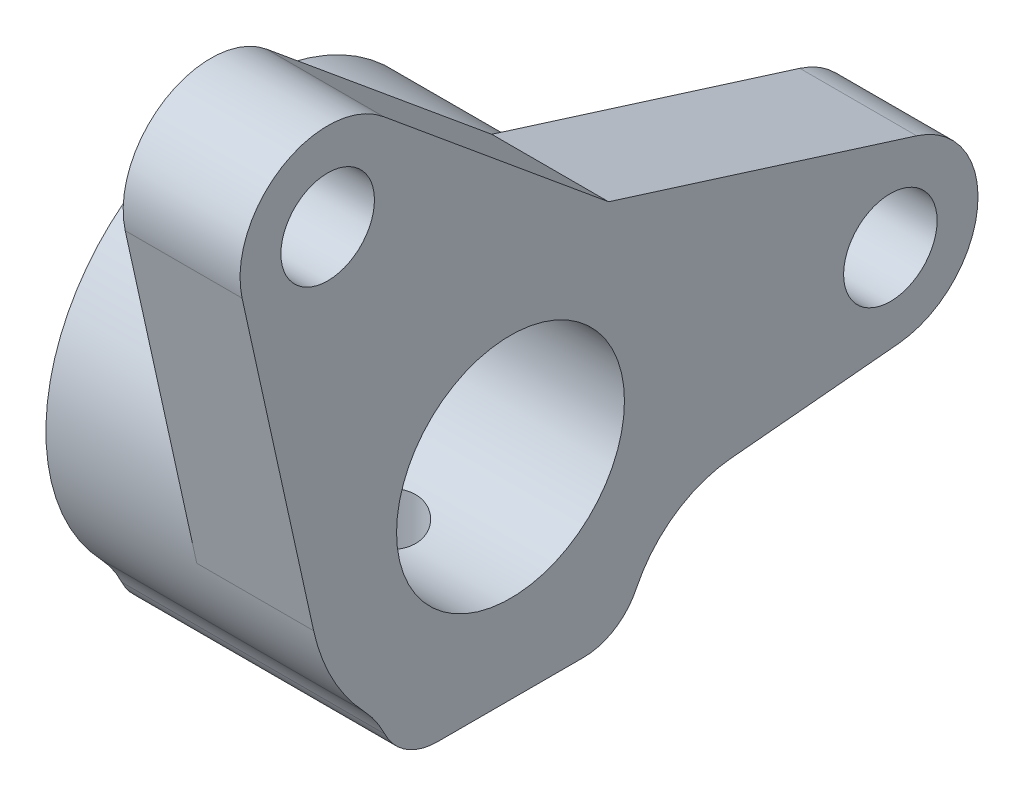
ISO-10303-21;
HEADER;
FILE_DESCRIPTION(('STEP AP214'),'2;1');
FILE_NAME('part.step','',(''),(''),'','','');
FILE_SCHEMA(('AUTOMOTIVE_DESIGN { 1 0 10303 214 1 1 1 1 }'));
ENDSEC;
DATA;
#1=APPLICATION_CONTEXT('core data for automotive mechanical design processes');
#2=APPLICATION_PROTOCOL_DEFINITION('international standard','automotive_design',2000,#1);
#3=PRODUCT_CONTEXT('',#1,'mechanical');
#4=PRODUCT('Part','Part','',(#3));
#5=PRODUCT_RELATED_PRODUCT_CATEGORY('part','',(#4));
#6=PRODUCT_DEFINITION_FORMATION('','',#4);
#7=PRODUCT_DEFINITION_CONTEXT('part definition',#1,'design');
#8=PRODUCT_DEFINITION('design','',#6,#7);
#9=PRODUCT_DEFINITION_SHAPE('','',#8);
#10=(LENGTH_UNIT() NAMED_UNIT(*) SI_UNIT(.MILLI.,.METRE.));
#11=(NAMED_UNIT(*) PLANE_ANGLE_UNIT() SI_UNIT($,.RADIAN.));
#12=(NAMED_UNIT(*) SI_UNIT($,.STERADIAN.) SOLID_ANGLE_UNIT());
#13=UNCERTAINTY_MEASURE_WITH_UNIT(LENGTH_MEASURE(1.E-05),#10,'distance_accuracy_value','');
#14=(GEOMETRIC_REPRESENTATION_CONTEXT(3) GLOBAL_UNCERTAINTY_ASSIGNED_CONTEXT((#13)) GLOBAL_UNIT_ASSIGNED_CONTEXT((#10,
#11,#12)) REPRESENTATION_CONTEXT('',''));
#15=CARTESIAN_POINT('',(0.,0.,0.));
#16=DIRECTION('',(0.,0.,1.));
#17=DIRECTION('',(1.,0.,0.));
#18=AXIS2_PLACEMENT_3D('',#15,#16,#17);
#19=CARTESIAN_POINT('',(-10.5,0.,0.));
#20=DIRECTION('',(1.,0.,0.));
#21=DIRECTION('',(0.,0.,-1.));
#22=AXIS2_PLACEMENT_3D('',#19,#20,#21);
#23=PLANE('',#22);
#24=CARTESIAN_POINT('',(-10.5,10.2399340465581,6.25649668122183));
#25=DIRECTION('',(-1.,0.,0.));
#26=DIRECTION('',(0.,0.,1.));
#27=AXIS2_PLACEMENT_3D('',#24,#25,#26);
#28=CIRCLE('',#27,1.59999999999999);
#29=CARTESIAN_POINT('',(-10.5,10.2399340465581,7.85649668122181));
#30=VERTEX_POINT('',#29);
#31=EDGE_CURVE('E587',#30,#30,#28,.T.);
#32=ORIENTED_EDGE('',*,*,#31,.F.);
#33=EDGE_LOOP('',(#32));
#34=FACE_BOUND('',#33,.T.);
#35=CARTESIAN_POINT('',(-10.5,-7.50446189380285,-7.90525468814642));
#36=DIRECTION('',(1.,0.,0.));
#37=DIRECTION('',(0.,0.,-1.));
#38=AXIS2_PLACEMENT_3D('',#35,#36,#37);
#39=CIRCLE('',#38,4.00000000000001);
#40=CARTESIAN_POINT('',(-10.5,-3.52167690603392,-7.53454760539433));
#41=VERTEX_POINT('',#40);
#42=CARTESIAN_POINT('',(-10.5,-4.75053092359996,-5.00424379341379));
#43=VERTEX_POINT('',#42);
#44=EDGE_CURVE('E157',#41,#43,#39,.T.);
#45=ORIENTED_EDGE('',*,*,#44,.T.);
#46=CARTESIAN_POINT('',(-10.5,0.,0.));
#47=DIRECTION('',(1.,0.,0.));
#48=DIRECTION('',(0.,0.,-1.));
#49=AXIS2_PLACEMENT_3D('',#46,#47,#48);
#50=CIRCLE('',#49,6.9);
#51=CARTESIAN_POINT('',(-10.5,-1.48860487136868,6.73751107879887));
#52=VERTEX_POINT('',#51);
#53=EDGE_CURVE('E223',#43,#52,#50,.T.);
#54=ORIENTED_EDGE('',*,*,#53,.T.);
#55=DIRECTION('',(0.,-0.976450880985343,-0.215739836430243));
#56=VECTOR('',#55,1.);
#57=CARTESIAN_POINT('',(-10.5,-1.48860487136868,6.73751107879887));
#58=LINE('',#57,#56);
#59=CARTESIAN_POINT('',(-10.5,9.5927145372674,9.18584932417786));
#60=VERTEX_POINT('',#59);
#61=EDGE_CURVE('E154',#60,#52,#58,.T.);
#62=ORIENTED_EDGE('',*,*,#61,.F.);
#63=CARTESIAN_POINT('',(-10.5,10.2399340465581,6.25649668122183));
#64=DIRECTION('',(1.,0.,0.));
#65=DIRECTION('',(0.,0.,-1.));
#66=AXIS2_PLACEMENT_3D('',#63,#64,#65);
#67=CIRCLE('',#66,3.);
#68=CARTESIAN_POINT('',(-10.5,12.5511428384146,4.34382474896435));
#69=VERTEX_POINT('',#68);
#70=EDGE_CURVE('E88',#69,#60,#67,.T.);
#71=ORIENTED_EDGE('',*,*,#70,.F.);
#72=DIRECTION('',(0.,-0.637557310752494,-0.770402930618808));
#73=VECTOR('',#72,1.);
#74=CARTESIAN_POINT('',(-10.5,5.31578022126978,-4.39914544419221));
#75=LINE('',#74,#73);
#76=CARTESIAN_POINT('',(-10.5,6.17695717575124,-3.35852801525733));
#77=VERTEX_POINT('',#76);
#78=EDGE_CURVE('E168',#69,#77,#75,.T.);
#79=ORIENTED_EDGE('',*,*,#78,.T.);
#80=DIRECTION('',(0.,-0.299999999999995,-0.953939201416947));
#81=VECTOR('',#80,1.);
#82=CARTESIAN_POINT('',(-10.5,6.58218048977694,-2.06999999999997));
#83=LINE('',#82,#81);
#84=CARTESIAN_POINT('',(-10.5,2.86181760425091,-13.9));
#85=VERTEX_POINT('',#84);
#86=EDGE_CURVE('E130',#77,#85,#83,.T.);
#87=ORIENTED_EDGE('',*,*,#86,.T.);
#88=CARTESIAN_POINT('',(-10.5,0.,-13.));
#89=DIRECTION('',(1.,0.,0.));
#90=DIRECTION('',(0.,0.,-1.));
#91=AXIS2_PLACEMENT_3D('',#88,#89,#90);
#92=CIRCLE('',#91,2.99999999999999);
#93=CARTESIAN_POINT('',(-10.5,-2.98708874082661,-13.2780303120641));
#94=VERTEX_POINT('',#93);
#95=EDGE_CURVE('E164',#85,#94,#92,.F.);
#96=ORIENTED_EDGE('',*,*,#95,.T.);
#97=DIRECTION('',(0.,-0.0926767706880218,0.995696246942229));
#98=VECTOR('',#97,1.);
#99=CARTESIAN_POINT('',(-10.5,-4.18670160661286,-0.38968710179114));
#100=LINE('',#99,#98);
#101=EDGE_CURVE('E161',#94,#41,#100,.T.);
#102=ORIENTED_EDGE('',*,*,#101,.T.);
#103=EDGE_LOOP('',(#45,#54,#62,#71,#79,#87,#96,#102));
#104=FACE_BOUND('',#103,.T.);
#105=CARTESIAN_POINT('',(-10.5,0.,-13.));
#106=DIRECTION('',(-1.,0.,0.));
#107=DIRECTION('',(0.,0.,1.));
#108=AXIS2_PLACEMENT_3D('',#105,#106,#107);
#109=CIRCLE('',#108,1.59999999999999);
#110=CARTESIAN_POINT('',(-10.5,0.,-11.4));
#111=VERTEX_POINT('',#110);
#112=EDGE_CURVE('E580',#111,#111,#109,.T.);
#113=ORIENTED_EDGE('',*,*,#112,.F.);
#114=EDGE_LOOP('',(#113));
#115=FACE_BOUND('',#114,.T.);
#116=ADVANCED_FACE('F45',(#34,#104,#115),#23,.F.);
#117=CARTESIAN_POINT('',(-6.50000000000003,-1.48860487136868,6.73751107879887));
#118=DIRECTION('',(0.,0.215739836430243,-0.976450880985343));
#119=DIRECTION('',(0.,0.976450880985343,0.215739836430243));
#120=AXIS2_PLACEMENT_3D('',#117,#118,#119);
#121=PLANE('',#120);
#122=ORIENTED_EDGE('',*,*,#61,.T.);
#123=DIRECTION('',(-1.,0.,0.));
#124=VECTOR('',#123,1.);
#125=CARTESIAN_POINT('',(-6.50000000000003,-1.48860487136868,6.73751107879887));
#126=LINE('',#125,#124);
#127=CARTESIAN_POINT('',(-6.50000000000003,-1.48860487136868,6.73751107879887));
#128=VERTEX_POINT('',#127);
#129=EDGE_CURVE('E11',#128,#52,#126,.T.);
#130=ORIENTED_EDGE('',*,*,#129,.F.);
#131=DIRECTION('',(0.,-0.976450880985343,-0.215739836430243));
#132=VECTOR('',#131,1.);
#133=CARTESIAN_POINT('',(-6.50000000000003,-1.48860487136868,6.73751107879887));
#134=LINE('',#133,#132);
#135=CARTESIAN_POINT('',(-6.50000000000003,9.5927145372674,9.18584932417786));
#136=VERTEX_POINT('',#135);
#137=EDGE_CURVE('E171',#136,#128,#134,.T.);
#138=ORIENTED_EDGE('',*,*,#137,.F.);
#139=DIRECTION('',(-1.,0.,0.));
#140=VECTOR('',#139,1.);
#141=CARTESIAN_POINT('',(-6.50000000000003,9.5927145372674,9.18584932417786));
#142=LINE('',#141,#140);
#143=EDGE_CURVE('E153',#136,#60,#142,.T.);
#144=ORIENTED_EDGE('',*,*,#143,.T.);
#145=EDGE_LOOP('',(#122,#130,#138,#144));
#146=FACE_BOUND('',#145,.T.);
#147=ADVANCED_FACE('F47',(#146),#121,.F.);
#148=CARTESIAN_POINT('',(-6.50000000000003,0.,0.));
#149=DIRECTION('',(-1.,0.,0.));
#150=DIRECTION('',(0.,0.,1.));
#151=AXIS2_PLACEMENT_3D('',#148,#149,#150);
#152=CYLINDRICAL_SURFACE('',#151,6.9);
#153=ORIENTED_EDGE('',*,*,#129,.T.);
#154=ORIENTED_EDGE('',*,*,#53,.F.);
#155=DIRECTION('',(1.,0.,0.));
#156=VECTOR('',#155,1.);
#157=CARTESIAN_POINT('',(-15.5,-4.75053092359996,-5.00424379341379));
#158=LINE('',#157,#156);
#159=CARTESIAN_POINT('',(-15.5,-4.75053092359996,-5.00424379341379));
#160=VERTEX_POINT('',#159);
#161=EDGE_CURVE('E158',#160,#43,#158,.T.);
#162=ORIENTED_EDGE('',*,*,#161,.F.);
#163=CARTESIAN_POINT('',(-15.5,0.,0.));
#164=DIRECTION('',(1.,0.,0.));
#165=DIRECTION('',(0.,0.,-1.));
#166=AXIS2_PLACEMENT_3D('',#163,#164,#165);
#167=CIRCLE('',#166,6.9);
#168=CARTESIAN_POINT('',(-15.5,-4.75053092359996,5.00424379341379));
#169=VERTEX_POINT('',#168);
#170=EDGE_CURVE('E210',#160,#169,#167,.T.);
#171=ORIENTED_EDGE('',*,*,#170,.T.);
#172=DIRECTION('',(-1.,0.,0.));
#173=VECTOR('',#172,1.);
#174=CARTESIAN_POINT('',(-6.50000000000003,-4.75053092359996,5.00424379341379));
#175=LINE('',#174,#173);
#176=CARTESIAN_POINT('',(-6.50000000000003,-4.75053092359996,5.00424379341379));
#177=VERTEX_POINT('',#176);
#178=EDGE_CURVE('E54',#177,#169,#175,.T.);
#179=ORIENTED_EDGE('',*,*,#178,.F.);
#180=CARTESIAN_POINT('',(-6.50000000000003,0.,0.));
#181=DIRECTION('',(1.,0.,0.));
#182=DIRECTION('',(0.,0.,-1.));
#183=AXIS2_PLACEMENT_3D('',#180,#181,#182);
#184=CIRCLE('',#183,6.9);
#185=EDGE_CURVE('E96',#128,#177,#184,.T.);
#186=ORIENTED_EDGE('',*,*,#185,.F.);
#187=EDGE_LOOP('',(#153,#154,#162,#171,#179,#186));
#188=FACE_BOUND('',#187,.T.);
#189=ADVANCED_FACE('F216',(#188),#152,.T.);
#190=CARTESIAN_POINT('',(-6.50000000000003,-7.50446189380284,7.90525468814642));
#191=DIRECTION('',(-1.,0.,0.));
#192=DIRECTION('',(0.,0.,1.));
#193=AXIS2_PLACEMENT_3D('',#190,#191,#192);
#194=CYLINDRICAL_SURFACE('',#193,4.);
#195=ORIENTED_EDGE('',*,*,#178,.T.);
#196=CARTESIAN_POINT('',(-15.5,-7.50446189380284,7.90525468814642));
#197=DIRECTION('',(1.,0.,0.));
#198=DIRECTION('',(0.,0.,-1.));
#199=AXIS2_PLACEMENT_3D('',#196,#197,#198);
#200=CIRCLE('',#199,4.);
#201=CARTESIAN_POINT('',(-15.5,-5.76815396460094,4.30175156271547));
#202=VERTEX_POINT('',#201);
#203=EDGE_CURVE('E198',#202,#169,#200,.T.);
#204=ORIENTED_EDGE('',*,*,#203,.F.);
#205=DIRECTION('',(-1.,0.,0.));
#206=VECTOR('',#205,1.);
#207=CARTESIAN_POINT('',(-6.50000000000003,-5.76815396460094,4.30175156271547));
#208=LINE('',#207,#206);
#209=CARTESIAN_POINT('',(-6.50000000000003,-5.76815396460094,4.30175156271547));
#210=VERTEX_POINT('',#209);
#211=EDGE_CURVE('E188',#210,#202,#208,.T.);
#212=ORIENTED_EDGE('',*,*,#211,.F.);
#213=CARTESIAN_POINT('',(-6.50000000000003,-7.50446189380284,7.90525468814642));
#214=DIRECTION('',(1.,0.,0.));
#215=DIRECTION('',(0.,0.,-1.));
#216=AXIS2_PLACEMENT_3D('',#213,#214,#215);
#217=CIRCLE('',#216,4.);
#218=EDGE_CURVE('E201',#210,#177,#217,.T.);
#219=ORIENTED_EDGE('',*,*,#218,.T.);
#220=EDGE_LOOP('',(#195,#204,#212,#219));
#221=FACE_BOUND('',#220,.T.);
#222=ADVANCED_FACE('F196',(#221),#194,.F.);
#223=CARTESIAN_POINT('',(-6.50000000000003,-4.9,2.5));
#224=DIRECTION('',(-1.,0.,0.));
#225=DIRECTION('',(0.,0.,1.));
#226=AXIS2_PLACEMENT_3D('',#223,#224,#225);
#227=CYLINDRICAL_SURFACE('',#226,1.99999999999999);
#228=ORIENTED_EDGE('',*,*,#211,.T.);
#229=CARTESIAN_POINT('',(-15.5,-4.9,2.5));
#230=DIRECTION('',(1.,0.,0.));
#231=DIRECTION('',(0.,0.,-1.));
#232=AXIS2_PLACEMENT_3D('',#229,#230,#231);
#233=CIRCLE('',#232,1.99999999999999);
#234=CARTESIAN_POINT('',(-15.5,-6.89999999999999,2.5));
#235=VERTEX_POINT('',#234);
#236=EDGE_CURVE('E213',#235,#202,#233,.F.);
#237=ORIENTED_EDGE('',*,*,#236,.F.);
#238=DIRECTION('',(-1.,0.,0.));
#239=VECTOR('',#238,1.);
#240=CARTESIAN_POINT('',(-6.50000000000003,-6.89999999999999,2.5));
#241=LINE('',#240,#239);
#242=CARTESIAN_POINT('',(-6.50000000000003,-6.89999999999999,2.5));
#243=VERTEX_POINT('',#242);
#244=EDGE_CURVE('E185',#243,#235,#241,.T.);
#245=ORIENTED_EDGE('',*,*,#244,.F.);
#246=CARTESIAN_POINT('',(-6.50000000000003,-4.9,2.5));
#247=DIRECTION('',(1.,0.,0.));
#248=DIRECTION('',(0.,0.,-1.));
#249=AXIS2_PLACEMENT_3D('',#246,#247,#248);
#250=CIRCLE('',#249,1.99999999999999);
#251=EDGE_CURVE('E242',#243,#210,#250,.F.);
#252=ORIENTED_EDGE('',*,*,#251,.T.);
#253=EDGE_LOOP('',(#228,#237,#245,#252));
#254=FACE_BOUND('',#253,.T.);
#255=ADVANCED_FACE('F288',(#254),#227,.T.);
#256=CARTESIAN_POINT('',(-6.50000000000003,-6.89999999999999,0.));
#257=DIRECTION('',(0.,-1.,0.));
#258=DIRECTION('',(0.,0.,-1.));
#259=AXIS2_PLACEMENT_3D('',#256,#257,#258);
#260=PLANE('',#259);
#261=CARTESIAN_POINT('',(-11.,-6.89999999999999,0.));
#262=DIRECTION('',(0.,-1.,0.));
#263=DIRECTION('',(0.,0.,-1.));
#264=AXIS2_PLACEMENT_3D('',#261,#262,#263);
#265=CIRCLE('',#264,1.25);
#266=CARTESIAN_POINT('',(-11.,-6.89999999999999,-1.24999999999998));
#267=VERTEX_POINT('',#266);
#268=EDGE_CURVE('E581',#267,#267,#265,.T.);
#269=ORIENTED_EDGE('',*,*,#268,.F.);
#270=EDGE_LOOP('',(#269));
#271=FACE_BOUND('',#270,.T.);
#272=ORIENTED_EDGE('',*,*,#244,.T.);
#273=DIRECTION('',(0.,0.,1.));
#274=VECTOR('',#273,1.);
#275=CARTESIAN_POINT('',(-15.5,-6.89999999999999,0.));
#276=LINE('',#275,#274);
#277=CARTESIAN_POINT('',(-15.5,-6.89999999999999,-2.5));
#278=VERTEX_POINT('',#277);
#279=EDGE_CURVE('E228',#278,#235,#276,.T.);
#280=ORIENTED_EDGE('',*,*,#279,.F.);
#281=DIRECTION('',(-1.,0.,0.));
#282=VECTOR('',#281,1.);
#283=CARTESIAN_POINT('',(-6.50000000000003,-6.89999999999999,-2.5));
#284=LINE('',#283,#282);
#285=CARTESIAN_POINT('',(-6.50000000000003,-6.89999999999999,-2.5));
#286=VERTEX_POINT('',#285);
#287=EDGE_CURVE('E182',#286,#278,#284,.T.);
#288=ORIENTED_EDGE('',*,*,#287,.F.);
#289=DIRECTION('',(0.,0.,1.));
#290=VECTOR('',#289,1.);
#291=CARTESIAN_POINT('',(-6.50000000000003,-6.89999999999999,0.));
#292=LINE('',#291,#290);
#293=EDGE_CURVE('E245',#286,#243,#292,.T.);
#294=ORIENTED_EDGE('',*,*,#293,.T.);
#295=EDGE_LOOP('',(#272,#280,#288,#294));
#296=FACE_BOUND('',#295,.T.);
#297=ADVANCED_FACE('F290',(#271,#296),#260,.T.);
#298=CARTESIAN_POINT('',(-6.50000000000003,-4.9,-2.5));
#299=DIRECTION('',(-1.,0.,0.));
#300=DIRECTION('',(0.,0.,1.));
#301=AXIS2_PLACEMENT_3D('',#298,#299,#300);
#302=CYLINDRICAL_SURFACE('',#301,1.99999999999999);
#303=ORIENTED_EDGE('',*,*,#287,.T.);
#304=CARTESIAN_POINT('',(-15.5,-4.9,-2.5));
#305=DIRECTION('',(1.,0.,0.));
#306=DIRECTION('',(0.,0.,-1.));
#307=AXIS2_PLACEMENT_3D('',#304,#305,#306);
#308=CIRCLE('',#307,1.99999999999999);
#309=CARTESIAN_POINT('',(-15.5,-5.76815396460093,-4.30175156271547));
#310=VERTEX_POINT('',#309);
#311=EDGE_CURVE('E230',#310,#278,#308,.F.);
#312=ORIENTED_EDGE('',*,*,#311,.F.);
#313=DIRECTION('',(-1.,0.,0.));
#314=VECTOR('',#313,1.);
#315=CARTESIAN_POINT('',(-6.50000000000003,-5.76815396460093,-4.30175156271547));
#316=LINE('',#315,#314);
#317=CARTESIAN_POINT('',(-6.50000000000003,-5.76815396460093,-4.30175156271547));
#318=VERTEX_POINT('',#317);
#319=EDGE_CURVE('E179',#318,#310,#316,.T.);
#320=ORIENTED_EDGE('',*,*,#319,.F.);
#321=CARTESIAN_POINT('',(-6.50000000000003,-4.9,-2.5));
#322=DIRECTION('',(1.,0.,0.));
#323=DIRECTION('',(0.,0.,-1.));
#324=AXIS2_PLACEMENT_3D('',#321,#322,#323);
#325=CIRCLE('',#324,1.99999999999999);
#326=EDGE_CURVE('E248',#318,#286,#325,.F.);
#327=ORIENTED_EDGE('',*,*,#326,.T.);
#328=EDGE_LOOP('',(#303,#312,#320,#327));
#329=FACE_BOUND('',#328,.T.);
#330=ADVANCED_FACE('F281',(#329),#302,.T.);
#331=CARTESIAN_POINT('',(-6.50000000000003,-7.50446189380285,-7.90525468814642));
#332=DIRECTION('',(-1.,0.,0.));
#333=DIRECTION('',(0.,0.,1.));
#334=AXIS2_PLACEMENT_3D('',#331,#332,#333);
#335=CYLINDRICAL_SURFACE('',#334,4.00000000000001);
#336=ORIENTED_EDGE('',*,*,#44,.F.);
#337=DIRECTION('',(-1.,0.,0.));
#338=VECTOR('',#337,1.);
#339=CARTESIAN_POINT('',(-6.50000000000003,-3.52167690603392,-7.53454760539433));
#340=LINE('',#339,#338);
#341=CARTESIAN_POINT('',(-6.50000000000003,-3.52167690603392,-7.53454760539433));
#342=VERTEX_POINT('',#341);
#343=EDGE_CURVE('E177',#342,#41,#340,.T.);
#344=ORIENTED_EDGE('',*,*,#343,.F.);
#345=CARTESIAN_POINT('',(-6.50000000000003,-7.50446189380285,-7.90525468814642));
#346=DIRECTION('',(1.,0.,0.));
#347=DIRECTION('',(0.,0.,-1.));
#348=AXIS2_PLACEMENT_3D('',#345,#346,#347);
#349=CIRCLE('',#348,4.00000000000001);
#350=EDGE_CURVE('E251',#342,#318,#349,.T.);
#351=ORIENTED_EDGE('',*,*,#350,.T.);
#352=ORIENTED_EDGE('',*,*,#319,.T.);
#353=CARTESIAN_POINT('',(-15.5,-7.50446189380285,-7.90525468814642));
#354=DIRECTION('',(1.,0.,0.));
#355=DIRECTION('',(0.,0.,-1.));
#356=AXIS2_PLACEMENT_3D('',#353,#354,#355);
#357=CIRCLE('',#356,4.00000000000001);
#358=EDGE_CURVE('E233',#160,#310,#357,.T.);
#359=ORIENTED_EDGE('',*,*,#358,.F.);
#360=ORIENTED_EDGE('',*,*,#161,.T.);
#361=EDGE_LOOP('',(#336,#344,#351,#352,#359,#360));
#362=FACE_BOUND('',#361,.T.);
#363=ADVANCED_FACE('F273',(#362),#335,.F.);
#364=CARTESIAN_POINT('',(-6.50000000000003,-4.18670160661286,-0.38968710179114));
#365=DIRECTION('',(0.,-0.995696246942229,-0.0926767706880218));
#366=DIRECTION('',(0.,0.0926767706880218,-0.995696246942229));
#367=AXIS2_PLACEMENT_3D('',#364,#365,#366);
#368=PLANE('',#367);
#369=ORIENTED_EDGE('',*,*,#101,.F.);
#370=DIRECTION('',(-1.,0.,0.));
#371=VECTOR('',#370,1.);
#372=CARTESIAN_POINT('',(-6.50000000000003,-2.98708874082661,-13.2780303120641));
#373=LINE('',#372,#371);
#374=CARTESIAN_POINT('',(-6.50000000000003,-2.98708874082661,-13.2780303120641));
#375=VERTEX_POINT('',#374);
#376=EDGE_CURVE('E175',#375,#94,#373,.T.);
#377=ORIENTED_EDGE('',*,*,#376,.F.);
#378=DIRECTION('',(0.,-0.0926767706880218,0.995696246942229));
#379=VECTOR('',#378,1.);
#380=CARTESIAN_POINT('',(-6.50000000000003,-4.18670160661286,-0.38968710179114));
#381=LINE('',#380,#379);
#382=EDGE_CURVE('E254',#375,#342,#381,.T.);
#383=ORIENTED_EDGE('',*,*,#382,.T.);
#384=ORIENTED_EDGE('',*,*,#343,.T.);
#385=EDGE_LOOP('',(#369,#377,#383,#384));
#386=FACE_BOUND('',#385,.T.);
#387=ADVANCED_FACE('F275',(#386),#368,.T.);
#388=CARTESIAN_POINT('',(-6.50000000000003,0.,-13.));
#389=DIRECTION('',(-1.,0.,0.));
#390=DIRECTION('',(0.,0.,1.));
#391=AXIS2_PLACEMENT_3D('',#388,#389,#390);
#392=CYLINDRICAL_SURFACE('',#391,2.99999999999999);
#393=ORIENTED_EDGE('',*,*,#95,.F.);
#394=DIRECTION('',(-1.,0.,0.));
#395=VECTOR('',#394,1.);
#396=CARTESIAN_POINT('',(-6.50000000000003,2.86181760425091,-13.9));
#397=LINE('',#396,#395);
#398=CARTESIAN_POINT('',(-6.50000000000003,2.86181760425091,-13.9));
#399=VERTEX_POINT('',#398);
#400=EDGE_CURVE('E135',#399,#85,#397,.T.);
#401=ORIENTED_EDGE('',*,*,#400,.F.);
#402=CARTESIAN_POINT('',(-6.50000000000003,0.,-13.));
#403=DIRECTION('',(1.,0.,0.));
#404=DIRECTION('',(0.,0.,-1.));
#405=AXIS2_PLACEMENT_3D('',#402,#403,#404);
#406=CIRCLE('',#405,2.99999999999999);
#407=EDGE_CURVE('E143',#399,#375,#406,.F.);
#408=ORIENTED_EDGE('',*,*,#407,.T.);
#409=ORIENTED_EDGE('',*,*,#376,.T.);
#410=EDGE_LOOP('',(#393,#401,#408,#409));
#411=FACE_BOUND('',#410,.T.);
#412=ADVANCED_FACE('F258',(#411),#392,.T.);
#413=CARTESIAN_POINT('',(-6.50000000000003,6.58218048977694,-2.06999999999997));
#414=DIRECTION('',(0.,0.953939201416947,-0.299999999999995));
#415=DIRECTION('',(0.,0.299999999999995,0.953939201416947));
#416=AXIS2_PLACEMENT_3D('',#413,#414,#415);
#417=PLANE('',#416);
#418=ORIENTED_EDGE('',*,*,#86,.F.);
#419=DIRECTION('',(-1.,0.,0.));
#420=VECTOR('',#419,1.);
#421=CARTESIAN_POINT('',(-6.50000000000003,6.17695717575124,-3.35852801525733));
#422=LINE('',#421,#420);
#423=CARTESIAN_POINT('',(-6.50000000000003,6.17695717575124,-3.35852801525733));
#424=VERTEX_POINT('',#423);
#425=EDGE_CURVE('E125',#424,#77,#422,.T.);
#426=ORIENTED_EDGE('',*,*,#425,.F.);
#427=DIRECTION('',(0.,-0.299999999999995,-0.953939201416947));
#428=VECTOR('',#427,1.);
#429=CARTESIAN_POINT('',(-6.50000000000003,6.58218048977694,-2.06999999999997));
#430=LINE('',#429,#428);
#431=EDGE_CURVE('E128',#424,#399,#430,.T.);
#432=ORIENTED_EDGE('',*,*,#431,.T.);
#433=ORIENTED_EDGE('',*,*,#400,.T.);
#434=EDGE_LOOP('',(#418,#426,#432,#433));
#435=FACE_BOUND('',#434,.T.);
#436=ADVANCED_FACE('F127',(#435),#417,.T.);
#437=CARTESIAN_POINT('',(-6.50000000000003,5.31578022126978,-4.39914544419221));
#438=DIRECTION('',(0.,0.770402930618808,-0.637557310752494));
#439=DIRECTION('',(0.,0.637557310752494,0.770402930618808));
#440=AXIS2_PLACEMENT_3D('',#437,#438,#439);
#441=PLANE('',#440);
#442=ORIENTED_EDGE('',*,*,#78,.F.);
#443=DIRECTION('',(-1.,0.,0.));
#444=VECTOR('',#443,1.);
#445=CARTESIAN_POINT('',(-6.50000000000003,12.5511428384146,4.34382474896435));
#446=LINE('',#445,#444);
#447=CARTESIAN_POINT('',(-6.50000000000003,12.5511428384146,4.34382474896435));
#448=VERTEX_POINT('',#447);
#449=EDGE_CURVE('E85',#448,#69,#446,.T.);
#450=ORIENTED_EDGE('',*,*,#449,.F.);
#451=DIRECTION('',(0.,-0.637557310752494,-0.770402930618808));
#452=VECTOR('',#451,1.);
#453=CARTESIAN_POINT('',(-6.50000000000003,5.31578022126978,-4.39914544419221));
#454=LINE('',#453,#452);
#455=EDGE_CURVE('E140',#448,#424,#454,.T.);
#456=ORIENTED_EDGE('',*,*,#455,.T.);
#457=ORIENTED_EDGE('',*,*,#425,.T.);
#458=EDGE_LOOP('',(#442,#450,#456,#457));
#459=FACE_BOUND('',#458,.T.);
#460=ADVANCED_FACE('F145',(#459),#441,.T.);
#461=CARTESIAN_POINT('',(-6.50000000000003,10.2399340465581,6.25649668122183));
#462=DIRECTION('',(-1.,0.,0.));
#463=DIRECTION('',(0.,0.,1.));
#464=AXIS2_PLACEMENT_3D('',#461,#462,#463);
#465=CYLINDRICAL_SURFACE('',#464,3.);
#466=ORIENTED_EDGE('',*,*,#70,.T.);
#467=ORIENTED_EDGE('',*,*,#143,.F.);
#468=CARTESIAN_POINT('',(-6.50000000000003,10.2399340465581,6.25649668122183));
#469=DIRECTION('',(1.,0.,0.));
#470=DIRECTION('',(0.,0.,-1.));
#471=AXIS2_PLACEMENT_3D('',#468,#469,#470);
#472=CIRCLE('',#471,3.);
#473=EDGE_CURVE('E62',#448,#136,#472,.T.);
#474=ORIENTED_EDGE('',*,*,#473,.F.);
#475=ORIENTED_EDGE('',*,*,#449,.T.);
#476=EDGE_LOOP('',(#466,#467,#474,#475));
#477=FACE_BOUND('',#476,.T.);
#478=ADVANCED_FACE('F314',(#477),#465,.T.);
#479=CARTESIAN_POINT('',(-6.50000000000003,0.,0.));
#480=DIRECTION('',(-1.,0.,0.));
#481=DIRECTION('',(0.,0.,1.));
#482=AXIS2_PLACEMENT_3D('',#479,#480,#481);
#483=CYLINDRICAL_SURFACE('',#482,3.9);
#484=CARTESIAN_POINT('',(-11.,-3.69425229241318,-1.24999999999998));
#485=CARTESIAN_POINT('',(-11.0682484860486,-3.69425249202975,-1.24999981851574));
#486=CARTESIAN_POINT('',(-11.1364991758303,-3.69616423604124,-1.24439162332229));
#487=CARTESIAN_POINT('',(-11.2709890476939,-3.70356864087391,-1.22217549490067));
#488=CARTESIAN_POINT('',(-11.3372277647005,-3.70906212313338,-1.20556503839252));
#489=CARTESIAN_POINT('',(-11.4657253213894,-3.72294525499145,-1.16197933309357));
#490=CARTESIAN_POINT('',(-11.5279912423078,-3.73132957068709,-1.13502316298144));
#491=CARTESIAN_POINT('',(-11.6471353457797,-3.75004212816715,-1.07157546452977));
#492=CARTESIAN_POINT('',(-11.7040124814841,-3.76037074650102,-1.03508208860501));
#493=CARTESIAN_POINT('',(-11.8128205231096,-3.78222689234488,-0.952182987490352));
#494=CARTESIAN_POINT('',(-11.8645280577062,-3.79378262878738,-0.905491446550815));
#495=CARTESIAN_POINT('',(-11.9595295912837,-3.81655154952694,-0.804132399041322));
#496=CARTESIAN_POINT('',(-12.0028223508566,-3.82776468315753,-0.749463719595481));
#497=CARTESIAN_POINT('',(-12.0807615712805,-3.84890914098067,-0.632086391287887));
#498=CARTESIAN_POINT('',(-12.1151764820459,-3.85880339530642,-0.569216726207719));
#499=CARTESIAN_POINT('',(-12.172855720546,-3.87586475293547,-0.438210016336588));
#500=CARTESIAN_POINT('',(-12.1961228133508,-3.88303253241409,-0.370074282599228));
#501=CARTESIAN_POINT('',(-12.2300957358477,-3.89363360596546,-0.232809588964275));
#502=CARTESIAN_POINT('',(-12.2411836752541,-3.89718023968885,-0.163784115542584));
#503=CARTESIAN_POINT('',(-12.2516958463166,-3.90054047280193,-0.024767448109522));
#504=CARTESIAN_POINT('',(-12.2511228630074,-3.90035496355748,0.04522351131958));
#505=CARTESIAN_POINT('',(-12.2385774259178,-3.89634993455908,0.181489272974421));
#506=CARTESIAN_POINT('',(-12.2270194960699,-3.89266256367315,0.247806749120412));
#507=CARTESIAN_POINT('',(-12.1935144246655,-3.88223193478106,0.377505603811696));
#508=CARTESIAN_POINT('',(-12.1715665944303,-3.87548847420794,0.440886787423543));
#509=CARTESIAN_POINT('',(-12.1176476883565,-3.85952943086424,0.563851339596208));
#510=CARTESIAN_POINT('',(-12.0855538006763,-3.85028376912299,0.623376791362487));
#511=CARTESIAN_POINT('',(-12.0123533103969,-3.83029005373227,0.736323820787967));
#512=CARTESIAN_POINT('',(-11.971244339982,-3.81954160564458,0.789743789221282));
#513=CARTESIAN_POINT('',(-11.8790670926206,-3.79712755134546,0.891433224785229));
#514=CARTESIAN_POINT('',(-11.8276419322899,-3.78544239211944,0.93937534164983));
#515=CARTESIAN_POINT('',(-11.7173758918458,-3.76287398163308,1.02605588920972));
#516=CARTESIAN_POINT('',(-11.6585340426479,-3.75199083546095,1.06479311525728));
#517=CARTESIAN_POINT('',(-11.534137845317,-3.73215680168481,1.13237198149316));
#518=CARTESIAN_POINT('',(-11.4685098408511,-3.72323132519097,1.1610860561774));
#519=CARTESIAN_POINT('',(-11.3329939148743,-3.70861960716114,1.20694936015078));
#520=CARTESIAN_POINT('',(-11.2631076300302,-3.70293212968847,1.22410300249002));
#521=CARTESIAN_POINT('',(-11.124208525375,-3.69571672749008,1.24571384351882));
#522=CARTESIAN_POINT('',(-11.0552825988707,-3.69402391384125,1.25067470765081));
#523=CARTESIAN_POINT('',(-10.9175762887994,-3.6945305211742,1.24917796012291));
#524=CARTESIAN_POINT('',(-10.8487958831554,-3.69672930192203,1.24272222668906));
#525=CARTESIAN_POINT('',(-10.7155472056535,-3.70460794784783,1.21902662181363));
#526=CARTESIAN_POINT('',(-10.6510113596189,-3.71017805972429,1.20212641747614));
#527=CARTESIAN_POINT('',(-10.5257006488687,-3.72405378497116,1.15842370562717));
#528=CARTESIAN_POINT('',(-10.4649264202616,-3.73235985951352,1.1316195286162));
#529=CARTESIAN_POINT('',(-10.346855206731,-3.75107916788838,1.06795793621506));
#530=CARTESIAN_POINT('',(-10.2897161913419,-3.76154790465228,1.03082428789277));
#531=CARTESIAN_POINT('',(-10.1822974486554,-3.78330082236317,0.947876721589622));
#532=CARTESIAN_POINT('',(-10.1320196012206,-3.7945852255009,0.902060432869092));
#533=CARTESIAN_POINT('',(-10.0374700690034,-3.81729784462759,0.800655240223665));
#534=CARTESIAN_POINT('',(-9.99355930639027,-3.82871059767071,0.744725419938528));
#535=CARTESIAN_POINT('',(-9.91572883121113,-3.84990100159293,0.626013033800037));
#536=CARTESIAN_POINT('',(-9.88180869444739,-3.85967872188721,0.563230759054195));
#537=CARTESIAN_POINT('',(-9.82524369954808,-3.87644490225491,0.432957757819265));
#538=CARTESIAN_POINT('',(-9.80251977068929,-3.88345285148584,0.365504003303034));
#539=CARTESIAN_POINT('',(-9.76882086667104,-3.89397514902182,0.227466234410047));
#540=CARTESIAN_POINT('',(-9.75784200371591,-3.89749065335179,0.156883263913449));
#541=CARTESIAN_POINT('',(-9.74827374799544,-3.90055130994385,0.0179048017392101));
#542=CARTESIAN_POINT('',(-9.749164284966,-3.90026313020792,-0.0504516246244253));
#543=CARTESIAN_POINT('',(-9.76204235217245,-3.89615222578194,-0.18599624928844));
#544=CARTESIAN_POINT('',(-9.77402909391139,-3.89232975223904,-0.253184530251688));
#545=CARTESIAN_POINT('',(-9.80842260120433,-3.88163575290623,-0.38357367023788));
#546=CARTESIAN_POINT('',(-9.83068393057892,-3.87480684334715,-0.446816632543047));
#547=CARTESIAN_POINT('',(-9.88486220563106,-3.85880353325989,-0.568698283629691));
#548=CARTESIAN_POINT('',(-9.91678084607551,-3.84962872109178,-0.627336161985573));
#549=CARTESIAN_POINT('',(-9.99066168342649,-3.82948551420842,-0.740585139439045));
#550=CARTESIAN_POINT('',(-10.0329371862301,-3.81846545330562,-0.794982550555959));
#551=CARTESIAN_POINT('',(-10.1257866376815,-3.7960140403001,-0.89608280734187));
#552=CARTESIAN_POINT('',(-10.1763631315445,-3.7845825628925,-0.942783284179289));
#553=CARTESIAN_POINT('',(-10.2865214953674,-3.76212006275806,-1.02883588187024));
#554=CARTESIAN_POINT('',(-10.3463586431633,-3.7511175121629,-1.06786960701198));
#555=CARTESIAN_POINT('',(-10.4720792861217,-3.73126773095983,-1.13528973262008));
#556=CARTESIAN_POINT('',(-10.5379606429362,-3.72241974211857,-1.16367988067735));
#557=CARTESIAN_POINT('',(-10.6691573452021,-3.70850477123852,-1.20726155864071));
#558=CARTESIAN_POINT('',(-10.7341880807813,-3.70321605996959,-1.22323938191068));
#559=CARTESIAN_POINT('',(-10.8661455295547,-3.69609020716368,-1.24460720539301));
#560=CARTESIAN_POINT('',(-10.9330717051273,-3.69425209665798,-1.25000017797362));
#561=CARTESIAN_POINT('',(-11.,-3.69425229241318,-1.24999999999998));
#562=B_SPLINE_CURVE_WITH_KNOTS('',3,(#484,#485,#486,#487,#488,#489,#490,#491,#492,#493,#494,
#495,#496,#497,#498,#499,#500,#501,#502,#503,#504,#505,#506,#507,#508,#509,#510,#511,#512,#513,
#514,#515,#516,#517,#518,#519,#520,#521,#522,#523,#524,#525,#526,#527,#528,#529,#530,#531,#532,
#533,#534,#535,#536,#537,#538,#539,#540,#541,#542,#543,#544,#545,#546,#547,#548,#549,#550,#551,
#552,#553,#554,#555,#556,#557,#558,#559,#560,#561),.UNSPECIFIED.,.T.,.F.,(4,2,2,2,2,2,2,2,2,2,2,
2,2,2,2,2,2,2,2,2,2,2,2,2,2,2,2,2,2,2,2,2,2,2,2,2,2,2,4),(0.,0.204497997350409,
0.409042910915257,0.613212418766928,0.817421508500113,1.02832734526816,1.23926422275183,
1.45524592223191,1.67117402251439,1.88011484899977,2.08900577372408,2.29031453958058,
2.49163665074981,2.69549549247218,2.8994079420814,3.11223671809477,3.32509333177384,
3.54056787074111,3.75596010834278,3.96229297592138,4.16859190136355,4.36851114950394,
4.56846411315163,4.77438630887383,4.9803648115616,5.19539279949904,5.41041165612199,
5.62388941003612,5.83729647767696,6.04138481388471,6.24545864867633,6.44672846903434,
6.6480336308521,6.85640721353114,7.06484480661963,7.28065601809826,7.49639117118007,
7.69698972068861,7.89753193136598),.UNSPECIFIED.);
#563=CARTESIAN_POINT('',(-11.,-3.69425229241318,-1.24999999999998));
#564=VERTEX_POINT('',#563);
#565=EDGE_CURVE('E573',#564,#564,#562,.T.);
#566=ORIENTED_EDGE('',*,*,#565,.F.);
#567=EDGE_LOOP('',(#566));
#568=FACE_BOUND('',#567,.T.);
#569=CARTESIAN_POINT('',(-6.50000000000003,0.,0.));
#570=DIRECTION('',(1.,0.,0.));
#571=DIRECTION('',(0.,0.,-1.));
#572=AXIS2_PLACEMENT_3D('',#569,#570,#571);
#573=CIRCLE('',#572,3.9);
#574=CARTESIAN_POINT('',(-6.50000000000003,0.,-3.9));
#575=VERTEX_POINT('',#574);
#576=EDGE_CURVE('E147',#575,#575,#573,.T.);
#577=ORIENTED_EDGE('',*,*,#576,.T.);
#578=EDGE_LOOP('',(#577));
#579=FACE_BOUND('',#578,.T.);
#580=CARTESIAN_POINT('',(-15.5,0.,0.));
#581=DIRECTION('',(1.,0.,0.));
#582=DIRECTION('',(0.,0.,-1.));
#583=AXIS2_PLACEMENT_3D('',#580,#581,#582);
#584=CIRCLE('',#583,3.9);
#585=CARTESIAN_POINT('',(-15.5,0.,-3.9));
#586=VERTEX_POINT('',#585);
#587=EDGE_CURVE('E220',#586,#586,#584,.T.);
#588=ORIENTED_EDGE('',*,*,#587,.F.);
#589=EDGE_LOOP('',(#588));
#590=FACE_BOUND('',#589,.T.);
#591=ADVANCED_FACE('F311',(#568,#579,#590),#483,.F.);
#592=CARTESIAN_POINT('',(-6.50000000000003,0.,0.));
#593=DIRECTION('',(1.,0.,0.));
#594=DIRECTION('',(0.,0.,-1.));
#595=AXIS2_PLACEMENT_3D('',#592,#593,#594);
#596=PLANE('',#595);
#597=CARTESIAN_POINT('',(-6.50000000000003,0.,-13.));
#598=DIRECTION('',(1.,0.,0.));
#599=DIRECTION('',(0.,0.,-1.));
#600=AXIS2_PLACEMENT_3D('',#597,#598,#599);
#601=CIRCLE('',#600,1.59999999999999);
#602=CARTESIAN_POINT('',(-6.50000000000003,0.,-14.6));
#603=VERTEX_POINT('',#602);
#604=EDGE_CURVE('E584',#603,#603,#601,.T.);
#605=ORIENTED_EDGE('',*,*,#604,.F.);
#606=EDGE_LOOP('',(#605));
#607=FACE_BOUND('',#606,.T.);
#608=CARTESIAN_POINT('',(-6.50000000000003,10.2399340465581,6.25649668122183));
#609=DIRECTION('',(1.,0.,0.));
#610=DIRECTION('',(0.,0.,-1.));
#611=AXIS2_PLACEMENT_3D('',#608,#609,#610);
#612=CIRCLE('',#611,1.59999999999999);
#613=CARTESIAN_POINT('',(-6.50000000000003,10.2399340465581,4.65649668122183));
#614=VERTEX_POINT('',#613);
#615=EDGE_CURVE('E237',#614,#614,#612,.T.);
#616=ORIENTED_EDGE('',*,*,#615,.F.);
#617=EDGE_LOOP('',(#616));
#618=FACE_BOUND('',#617,.T.);
#619=ORIENTED_EDGE('',*,*,#137,.T.);
#620=ORIENTED_EDGE('',*,*,#185,.T.);
#621=ORIENTED_EDGE('',*,*,#218,.F.);
#622=ORIENTED_EDGE('',*,*,#251,.F.);
#623=ORIENTED_EDGE('',*,*,#293,.F.);
#624=ORIENTED_EDGE('',*,*,#326,.F.);
#625=ORIENTED_EDGE('',*,*,#350,.F.);
#626=ORIENTED_EDGE('',*,*,#382,.F.);
#627=ORIENTED_EDGE('',*,*,#407,.F.);
#628=ORIENTED_EDGE('',*,*,#431,.F.);
#629=ORIENTED_EDGE('',*,*,#455,.F.);
#630=ORIENTED_EDGE('',*,*,#473,.T.);
#631=EDGE_LOOP('',(#619,#620,#621,#622,#623,#624,#625,#626,#627,#628,#629,#630));
#632=FACE_BOUND('',#631,.T.);
#633=ORIENTED_EDGE('',*,*,#576,.F.);
#634=EDGE_LOOP('',(#633));
#635=FACE_BOUND('',#634,.T.);
#636=ADVANCED_FACE('F138',(#607,#618,#632,#635),#596,.T.);
#637=CARTESIAN_POINT('',(-15.5,0.,0.));
#638=DIRECTION('',(1.,0.,0.));
#639=DIRECTION('',(0.,0.,-1.));
#640=AXIS2_PLACEMENT_3D('',#637,#638,#639);
#641=PLANE('',#640);
#642=ORIENTED_EDGE('',*,*,#587,.T.);
#643=EDGE_LOOP('',(#642));
#644=FACE_BOUND('',#643,.T.);
#645=ORIENTED_EDGE('',*,*,#170,.F.);
#646=ORIENTED_EDGE('',*,*,#358,.T.);
#647=ORIENTED_EDGE('',*,*,#311,.T.);
#648=ORIENTED_EDGE('',*,*,#279,.T.);
#649=ORIENTED_EDGE('',*,*,#236,.T.);
#650=ORIENTED_EDGE('',*,*,#203,.T.);
#651=EDGE_LOOP('',(#645,#646,#647,#648,#649,#650));
#652=FACE_BOUND('',#651,.T.);
#653=ADVANCED_FACE('F207',(#644,#652),#641,.F.);
#654=CARTESIAN_POINT('',(-10.5,10.2399340465581,6.25649668122183));
#655=DIRECTION('',(-1.,0.,0.));
#656=DIRECTION('',(0.,0.,1.));
#657=AXIS2_PLACEMENT_3D('',#654,#655,#656);
#658=CYLINDRICAL_SURFACE('',#657,1.59999999999999);
#659=ORIENTED_EDGE('',*,*,#31,.T.);
#660=EDGE_LOOP('',(#659));
#661=FACE_BOUND('',#660,.T.);
#662=ORIENTED_EDGE('',*,*,#615,.T.);
#663=EDGE_LOOP('',(#662));
#664=FACE_BOUND('',#663,.T.);
#665=ADVANCED_FACE('F371',(#661,#664),#658,.F.);
#666=CARTESIAN_POINT('',(-10.5,0.,-13.));
#667=DIRECTION('',(-1.,0.,0.));
#668=DIRECTION('',(0.,0.,1.));
#669=AXIS2_PLACEMENT_3D('',#666,#667,#668);
#670=CYLINDRICAL_SURFACE('',#669,1.59999999999999);
#671=ORIENTED_EDGE('',*,*,#112,.T.);
#672=EDGE_LOOP('',(#671));
#673=FACE_BOUND('',#672,.T.);
#674=ORIENTED_EDGE('',*,*,#604,.T.);
#675=EDGE_LOOP('',(#674));
#676=FACE_BOUND('',#675,.T.);
#677=ADVANCED_FACE('F377',(#673,#676),#670,.F.);
#678=CARTESIAN_POINT('',(-11.,-6.89999999999999,0.));
#679=DIRECTION('',(0.,-1.,0.));
#680=DIRECTION('',(0.,0.,-1.));
#681=AXIS2_PLACEMENT_3D('',#678,#679,#680);
#682=CYLINDRICAL_SURFACE('',#681,1.25);
#683=ORIENTED_EDGE('',*,*,#268,.T.);
#684=EDGE_LOOP('',(#683));
#685=FACE_BOUND('',#684,.T.);
#686=ORIENTED_EDGE('',*,*,#565,.T.);
#687=EDGE_LOOP('',(#686));
#688=FACE_BOUND('',#687,.T.);
#689=ADVANCED_FACE('F385',(#685,#688),#682,.F.);
#690=CLOSED_SHELL('',(#116,#147,#189,#222,#255,#297,#330,#363,#387,#412,#436,#460,#478,#591,
#636,#653,#665,#677,#689));
#691=MANIFOLD_SOLID_BREP('B2',#690);
#692=ADVANCED_BREP_SHAPE_REPRESENTATION('',(#18,#691),#14);
#693=SHAPE_DEFINITION_REPRESENTATION(#9,#692);
ENDSEC;
END-ISO-10303-21;
